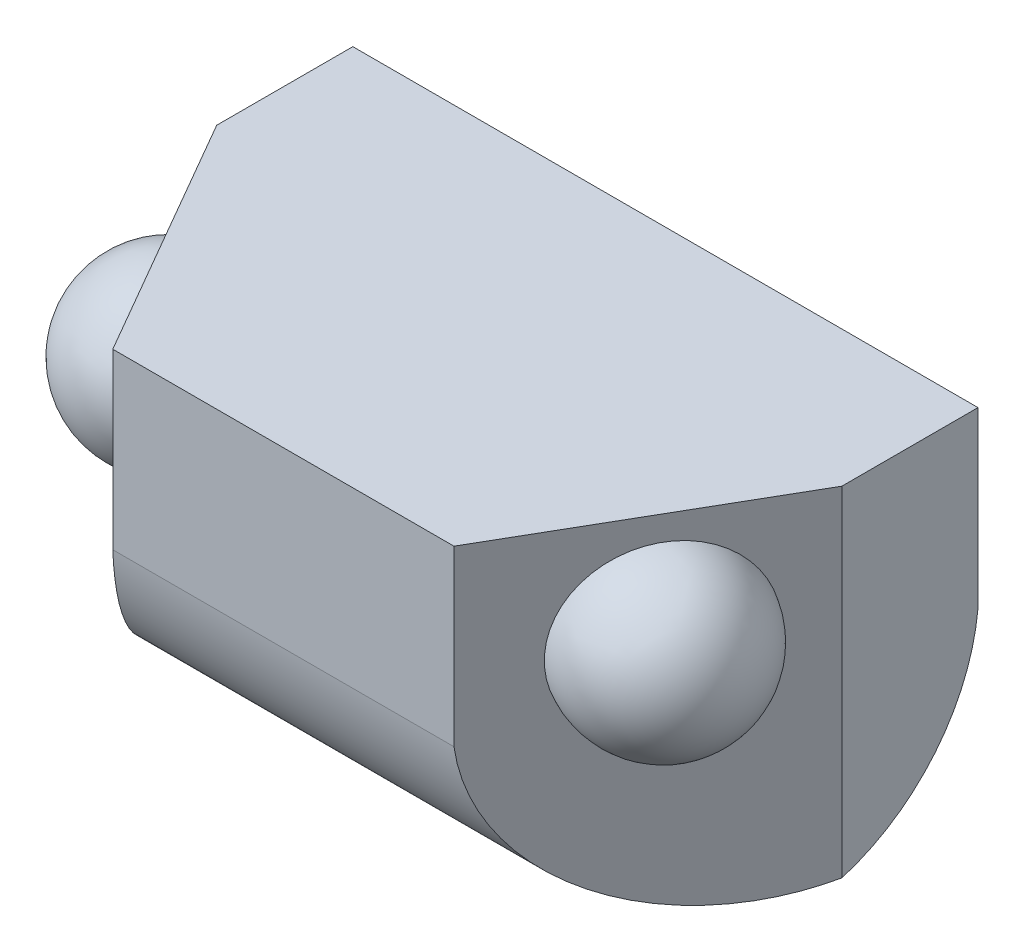
ISO-10303-21;
HEADER;
FILE_DESCRIPTION(('STEP AP214'),'2;1');
FILE_NAME('part.step','',(''),(''),'','','');
FILE_SCHEMA(('AUTOMOTIVE_DESIGN { 1 0 10303 214 1 1 1 1 }'));
ENDSEC;
DATA;
#1=APPLICATION_CONTEXT('core data for automotive mechanical design processes');
#2=APPLICATION_PROTOCOL_DEFINITION('international standard','automotive_design',2000,#1);
#3=PRODUCT_CONTEXT('',#1,'mechanical');
#4=PRODUCT('Part','Part','',(#3));
#5=PRODUCT_RELATED_PRODUCT_CATEGORY('part','',(#4));
#6=PRODUCT_DEFINITION_FORMATION('','',#4);
#7=PRODUCT_DEFINITION_CONTEXT('part definition',#1,'design');
#8=PRODUCT_DEFINITION('design','',#6,#7);
#9=PRODUCT_DEFINITION_SHAPE('','',#8);
#10=(LENGTH_UNIT() NAMED_UNIT(*) SI_UNIT(.MILLI.,.METRE.));
#11=(NAMED_UNIT(*) PLANE_ANGLE_UNIT() SI_UNIT($,.RADIAN.));
#12=(NAMED_UNIT(*) SI_UNIT($,.STERADIAN.) SOLID_ANGLE_UNIT());
#13=UNCERTAINTY_MEASURE_WITH_UNIT(LENGTH_MEASURE(1.E-05),#10,'distance_accuracy_value','');
#14=(GEOMETRIC_REPRESENTATION_CONTEXT(3) GLOBAL_UNCERTAINTY_ASSIGNED_CONTEXT((#13)) GLOBAL_UNIT_ASSIGNED_CONTEXT((#10,
#11,#12)) REPRESENTATION_CONTEXT('',''));
#15=CARTESIAN_POINT('',(0.,0.,0.));
#16=DIRECTION('',(0.,0.,1.));
#17=DIRECTION('',(1.,0.,0.));
#18=AXIS2_PLACEMENT_3D('',#15,#16,#17);
#19=CARTESIAN_POINT('',(90.,50.,55.));
#20=DIRECTION('',(-1.,0.,0.));
#21=DIRECTION('',(0.,0.,1.));
#22=AXIS2_PLACEMENT_3D('',#19,#20,#21);
#23=PLANE('',#22);
#24=DIRECTION('',(0.,1.,0.));
#25=VECTOR('',#24,1.);
#26=CARTESIAN_POINT('',(90.,-50.,-15.808309090852));
#27=LINE('',#26,#25);
#28=CARTESIAN_POINT('',(90.,-47.6901536046892,-15.808309090852));
#29=VERTEX_POINT('',#28);
#30=CARTESIAN_POINT('',(90.,50.,-15.808309090852));
#31=VERTEX_POINT('',#30);
#32=EDGE_CURVE('E175',#29,#31,#27,.T.);
#33=ORIENTED_EDGE('',*,*,#32,.F.);
#34=CARTESIAN_POINT('',(90.,5.25,0.));
#35=DIRECTION('',(-1.,0.,0.));
#36=DIRECTION('',(0.,0.,1.));
#37=AXIS2_PLACEMENT_3D('',#34,#35,#36);
#38=CIRCLE('',#37,55.25);
#39=CARTESIAN_POINT('',(90.,0.,-55.));
#40=VERTEX_POINT('',#39);
#41=EDGE_CURVE('E117',#40,#29,#38,.T.);
#42=ORIENTED_EDGE('',*,*,#41,.F.);
#43=DIRECTION('',(0.,-1.,0.));
#44=VECTOR('',#43,1.);
#45=CARTESIAN_POINT('',(90.,50.,-55.));
#46=LINE('',#45,#44);
#47=CARTESIAN_POINT('',(90.,50.,-55.));
#48=VERTEX_POINT('',#47);
#49=EDGE_CURVE('E111',#48,#40,#46,.T.);
#50=ORIENTED_EDGE('',*,*,#49,.F.);
#51=DIRECTION('',(0.,0.,-1.));
#52=VECTOR('',#51,1.);
#53=CARTESIAN_POINT('',(90.,50.,55.));
#54=LINE('',#53,#52);
#55=EDGE_CURVE('E115',#31,#48,#54,.T.);
#56=ORIENTED_EDGE('',*,*,#55,.F.);
#57=EDGE_LOOP('',(#33,#42,#50,#56));
#58=FACE_BOUND('',#57,.T.);
#59=ADVANCED_FACE('F35',(#58),#23,.F.);
#60=CARTESIAN_POINT('',(-90.,50.,55.));
#61=DIRECTION('',(0.,0.,-1.));
#62=DIRECTION('',(-1.,0.,0.));
#63=AXIS2_PLACEMENT_3D('',#60,#61,#62);
#64=PLANE('',#63);
#65=DIRECTION('',(0.,1.,0.));
#66=VECTOR('',#65,1.);
#67=CARTESIAN_POINT('',(49.1188036855349,-50.,55.));
#68=LINE('',#67,#66);
#69=CARTESIAN_POINT('',(49.1188036855349,0.,55.));
#70=VERTEX_POINT('',#69);
#71=CARTESIAN_POINT('',(49.1188036855349,50.,55.));
#72=VERTEX_POINT('',#71);
#73=EDGE_CURVE('E56',#70,#72,#68,.T.);
#74=ORIENTED_EDGE('',*,*,#73,.T.);
#75=DIRECTION('',(1.,0.,0.));
#76=VECTOR('',#75,1.);
#77=CARTESIAN_POINT('',(-90.,50.,55.));
#78=LINE('',#77,#76);
#79=CARTESIAN_POINT('',(-49.1188036855349,50.,55.));
#80=VERTEX_POINT('',#79);
#81=EDGE_CURVE('E119',#80,#72,#78,.T.);
#82=ORIENTED_EDGE('',*,*,#81,.F.);
#83=DIRECTION('',(0.,1.,0.));
#84=VECTOR('',#83,1.);
#85=CARTESIAN_POINT('',(-49.1188036855349,-50.,55.));
#86=LINE('',#85,#84);
#87=CARTESIAN_POINT('',(-49.1188036855349,-1.31838984174237E-13,55.));
#88=VERTEX_POINT('',#87);
#89=EDGE_CURVE('E185',#88,#80,#86,.T.);
#90=ORIENTED_EDGE('',*,*,#89,.F.);
#91=DIRECTION('',(1.,0.,0.));
#92=VECTOR('',#91,1.);
#93=CARTESIAN_POINT('',(-90.,0.,55.));
#94=LINE('',#93,#92);
#95=EDGE_CURVE('E112',#88,#70,#94,.T.);
#96=ORIENTED_EDGE('',*,*,#95,.T.);
#97=EDGE_LOOP('',(#74,#82,#90,#96));
#98=FACE_BOUND('',#97,.T.);
#99=ADVANCED_FACE('F165',(#98),#64,.F.);
#100=CARTESIAN_POINT('',(0.,50.,0.));
#101=DIRECTION('',(0.,-1.,0.));
#102=DIRECTION('',(0.,0.,-1.));
#103=AXIS2_PLACEMENT_3D('',#100,#101,#102);
#104=PLANE('',#103);
#105=DIRECTION('',(0.499999999999995,0.,-0.866025403784442));
#106=VECTOR('',#105,1.);
#107=CARTESIAN_POINT('',(49.1188036855349,50.,55.));
#108=LINE('',#107,#106);
#109=EDGE_CURVE('E104',#72,#31,#108,.T.);
#110=ORIENTED_EDGE('',*,*,#109,.T.);
#111=ORIENTED_EDGE('',*,*,#55,.T.);
#112=DIRECTION('',(-1.,0.,0.));
#113=VECTOR('',#112,1.);
#114=CARTESIAN_POINT('',(-90.,50.,-55.));
#115=LINE('',#114,#113);
#116=CARTESIAN_POINT('',(-90.,50.,-55.));
#117=VERTEX_POINT('',#116);
#118=EDGE_CURVE('E189',#48,#117,#115,.T.);
#119=ORIENTED_EDGE('',*,*,#118,.T.);
#120=DIRECTION('',(0.,0.,1.));
#121=VECTOR('',#120,1.);
#122=CARTESIAN_POINT('',(-90.,50.,55.));
#123=LINE('',#122,#121);
#124=CARTESIAN_POINT('',(-90.,50.,-15.808309090852));
#125=VERTEX_POINT('',#124);
#126=EDGE_CURVE('E190',#117,#125,#123,.T.);
#127=ORIENTED_EDGE('',*,*,#126,.T.);
#128=DIRECTION('',(-0.499999999999995,0.,-0.866025403784442));
#129=VECTOR('',#128,1.);
#130=CARTESIAN_POINT('',(-49.1188036855349,50.,55.));
#131=LINE('',#130,#129);
#132=EDGE_CURVE('E197',#80,#125,#131,.T.);
#133=ORIENTED_EDGE('',*,*,#132,.F.);
#134=ORIENTED_EDGE('',*,*,#81,.T.);
#135=EDGE_LOOP('',(#110,#111,#119,#127,#133,#134));
#136=FACE_BOUND('',#135,.T.);
#137=ADVANCED_FACE('F170',(#136),#104,.F.);
#138=CARTESIAN_POINT('',(90.,5.25,0.));
#139=DIRECTION('',(-1.,0.,0.));
#140=DIRECTION('',(0.,0.,1.));
#141=AXIS2_PLACEMENT_3D('',#138,#139,#140);
#142=CYLINDRICAL_SURFACE('',#141,55.25);
#143=CARTESIAN_POINT('',(-5.,0.,-55.));
#144=CARTESIAN_POINT('',(-4.9999882713397,0.279659518933165,-55.0266919024899));
#145=CARTESIAN_POINT('',(-4.97646125694057,0.559703141862609,-55.0512512303978));
#146=CARTESIAN_POINT('',(-4.88273898229655,1.11247234758045,-55.0955576876296));
#147=CARTESIAN_POINT('',(-4.81249616533935,1.38519017806621,-55.1152998850892));
#148=CARTESIAN_POINT('',(-4.62716959780222,1.91522044803943,-55.1499072876402));
#149=CARTESIAN_POINT('',(-4.51209694455087,2.17253668191824,-55.1647736980242));
#150=CARTESIAN_POINT('',(-4.24032032857952,2.66432096288032,-55.1900124176434));
#151=CARTESIAN_POINT('',(-4.08362504195175,2.89879375769299,-55.2003856622792));
#152=CARTESIAN_POINT('',(-3.73344551712168,3.33766423818145,-55.2173312558781));
#153=CARTESIAN_POINT('',(-3.54005046751516,3.54213274780862,-55.2239126664963));
#154=CARTESIAN_POINT('',(-3.12169670119766,3.91582438939544,-55.2342059818018));
#155=CARTESIAN_POINT('',(-2.8967368831528,4.0850462910452,-55.2379177863357));
#156=CARTESIAN_POINT('',(-2.42147037747128,4.3835233384727,-55.2434077432643));
#157=CARTESIAN_POINT('',(-2.17114651764086,4.51275116384496,-55.2451845759358));
#158=CARTESIAN_POINT('',(-1.65237362938163,4.72741624185298,-55.2476333894184));
#159=CARTESIAN_POINT('',(-1.38392452879401,4.81285332014079,-55.2483053658306));
#160=CARTESIAN_POINT('',(-0.836173176497464,4.93759109485978,-55.249152372038));
#161=CARTESIAN_POINT('',(-0.556858316863721,4.97683643754874,-55.2493268059599));
#162=CARTESIAN_POINT('',(0.00439596159632484,5.00789116744948,-55.2494718050764));
#163=CARTESIAN_POINT('',(0.286335383235546,4.99970050381507,-55.2494423700525));
#164=CARTESIAN_POINT('',(0.844917722951899,4.93610678173556,-55.2491172882946));
#165=CARTESIAN_POINT('',(1.12155915457999,4.88069066613185,-55.2488215679352));
#166=CARTESIAN_POINT('',(1.66161197844716,4.72420175618525,-55.2475529541873));
#167=CARTESIAN_POINT('',(1.92502332897145,4.62312881789523,-55.2465800586637));
#168=CARTESIAN_POINT('',(2.43111359951102,4.37820836392666,-55.2432566222232));
#169=CARTESIAN_POINT('',(2.67379410958054,4.2343641326026,-55.2409061870724));
#170=CARTESIAN_POINT('',(3.13154413165766,3.90799718981734,-55.2339395469131));
#171=CARTESIAN_POINT('',(3.3466138323362,3.72547474267577,-55.2293233573881));
#172=CARTESIAN_POINT('',(3.74286107052696,3.32713794025803,-55.2168876272833));
#173=CARTESIAN_POINT('',(3.924066165402,3.11135091734098,-55.2090707079778));
#174=CARTESIAN_POINT('',(4.24766193075809,2.65257655639623,-55.189387691919));
#175=CARTESIAN_POINT('',(4.39005323395633,2.40958966185425,-55.1775216611788));
#176=CARTESIAN_POINT('',(4.6318694801889,1.90375134883832,-55.1491534942709));
#177=CARTESIAN_POINT('',(4.73135093483771,1.64092659615991,-55.1326575032731));
#178=CARTESIAN_POINT('',(4.88491901931252,1.10267544659057,-55.0947814161674));
#179=CARTESIAN_POINT('',(4.93900561011759,0.827249038867615,-55.0734013158614));
#180=CARTESIAN_POINT('',(5.00048040551371,0.271212582640456,-55.0259223707046));
#181=CARTESIAN_POINT('',(5.00779732396879,-0.00940472530817487,-54.9998163849211));
#182=CARTESIAN_POINT('',(4.97554657880262,-0.567522063771189,-54.9435858405492));
#183=CARTESIAN_POINT('',(4.93597699645144,-0.845021966243265,-54.9134611175473));
#184=CARTESIAN_POINT('',(4.81080524424787,-1.39109959315269,-54.8501084837208));
#185=CARTESIAN_POINT('',(4.72488879594081,-1.65960295248719,-54.8168606815751));
#186=CARTESIAN_POINT('',(4.50932932480625,-2.17826308213933,-54.7489898266635));
#187=CARTESIAN_POINT('',(4.37968378511944,-2.42841879543584,-54.7143666948408));
#188=CARTESIAN_POINT('',(4.07912698575748,-2.90529705042896,-54.6453308489157));
#189=CARTESIAN_POINT('',(3.90791299709344,-3.1318294065235,-54.6109216703153));
#190=CARTESIAN_POINT('',(3.52944070141964,-3.55291217136776,-54.5446309000419));
#191=CARTESIAN_POINT('',(3.3221821238903,-3.74746234006548,-54.5127493273416));
#192=CARTESIAN_POINT('',(2.87764403254414,-4.09869314019168,-54.4536151108917));
#193=CARTESIAN_POINT('',(2.64040926491956,-4.25542922344469,-54.4263557067034));
#194=CARTESIAN_POINT('',(2.1423200751838,-4.52668328223075,-54.3782863698611));
#195=CARTESIAN_POINT('',(1.88146762254956,-4.64120477400381,-54.3574759000699));
#196=CARTESIAN_POINT('',(1.34718287923227,-4.82324606851124,-54.32403449836));
#197=CARTESIAN_POINT('',(1.07396048724357,-4.89136270601827,-54.3112998529331));
#198=CARTESIAN_POINT('',(0.519709943191823,-4.98083130353758,-54.2945181838));
#199=CARTESIAN_POINT('',(0.238682507704629,-5.00218754231259,-54.2904703652151));
#200=CARTESIAN_POINT('',(-0.31913402965054,-4.99748953950668,-54.2913570276702));
#201=CARTESIAN_POINT('',(-0.595928942434066,-4.97207408219445,-54.2961704861685));
#202=CARTESIAN_POINT('',(-1.14122987180414,-4.87588404394255,-54.314190899121));
#203=CARTESIAN_POINT('',(-1.40973595743377,-4.80510984093256,-54.3273977836411));
#204=CARTESIAN_POINT('',(-1.93088576538702,-4.62040056990761,-54.361258638705));
#205=CARTESIAN_POINT('',(-2.1835327098653,-4.50647430254438,-54.3819110907205));
#206=CARTESIAN_POINT('',(-2.66615679666948,-4.23883939629217,-54.429245969308));
#207=CARTESIAN_POINT('',(-2.89613315939026,-4.08512938996244,-54.4559286031446));
#208=CARTESIAN_POINT('',(-3.33016404145042,-3.74003745934505,-54.5139675284857));
#209=CARTESIAN_POINT('',(-3.53383943755744,-3.54818832597301,-54.545380475956));
#210=CARTESIAN_POINT('',(-3.9063041500025,-3.13344795591852,-54.6106609263638));
#211=CARTESIAN_POINT('',(-4.07508278839618,-2.91054725268537,-54.6445291763223));
#212=CARTESIAN_POINT('',(-4.3752626347509,-2.43657139720076,-54.7132270193043));
#213=CARTESIAN_POINT('',(-4.50611155560612,-2.18514761826587,-54.7480634313731));
#214=CARTESIAN_POINT('',(-4.72346941124214,-1.66385685549536,-54.8163289194608));
#215=CARTESIAN_POINT('',(-4.8100261957486,-1.39401013321266,-54.8497594782513));
#216=CARTESIAN_POINT('',(-4.91528170779142,-0.935630489751629,-54.9029567659093));
#217=CARTESIAN_POINT('',(-4.94699281039521,-0.750078529835498,-54.9235546138037));
#218=CARTESIAN_POINT('',(-4.98935589784394,-0.376409085851396,-54.963090551674));
#219=CARTESIAN_POINT('',(-5.00000789677485,-0.18829160349953,-54.9820286427602));
#220=CARTESIAN_POINT('',(-5.,0.,-55.));
#221=B_SPLINE_CURVE_WITH_KNOTS('',3,(#143,#144,#145,#146,#147,#148,#149,#150,#151,#152,#153,
#154,#155,#156,#157,#158,#159,#160,#161,#162,#163,#164,#165,#166,#167,#168,#169,#170,#171,#172,
#173,#174,#175,#176,#177,#178,#179,#180,#181,#182,#183,#184,#185,#186,#187,#188,#189,#190,#191,
#192,#193,#194,#195,#196,#197,#198,#199,#200,#201,#202,#203,#204,#205,#206,#207,#208,#209,#210,
#211,#212,#213,#214,#215,#216,#217,#218,#219,#220),.UNSPECIFIED.,.T.,.F.,(4,2,2,2,2,2,2,2,2,2,2,
2,2,2,2,2,2,2,2,2,2,2,2,2,2,2,2,2,2,2,2,2,2,2,2,2,2,2,4),(0.,0.842108421796893,1.68507542531736,
2.52783389040477,3.37041682310677,4.21097772404448,5.05156796048998,5.89273115260518,
6.73389769369151,7.5760712214559,8.41824565193794,9.26065300711714,10.1030630182622,
10.9454083584867,11.7877479424677,12.6293990581981,13.4710364530585,14.3115620146584,
15.1520882987639,15.993895404582,16.8357369607485,17.6833601573634,18.5310321478681,
19.3850730753091,20.239120412721,21.091907628991,21.9446237967831,22.7861545437178,
23.6276082840187,24.4576550558905,25.2876949118912,26.1175655764057,26.9474647689,
27.788237740786,28.6292675985432,29.4819903922115,30.3337900162869,30.9007725088697,
31.4677546222105),.UNSPECIFIED.);
#222=CARTESIAN_POINT('',(5.,0.,-55.));
#223=VERTEX_POINT('',#222);
#224=CARTESIAN_POINT('',(-5.,0.,-55.));
#225=VERTEX_POINT('',#224);
#226=EDGE_CURVE('E48',#223,#225,#221,.T.);
#227=ORIENTED_EDGE('',*,*,#226,.F.);
#228=DIRECTION('',(-1.,0.,0.));
#229=VECTOR('',#228,1.);
#230=CARTESIAN_POINT('',(-90.,0.,-55.));
#231=LINE('',#230,#229);
#232=EDGE_CURVE('E100',#40,#223,#231,.T.);
#233=ORIENTED_EDGE('',*,*,#232,.F.);
#234=ORIENTED_EDGE('',*,*,#41,.T.);
#235=CARTESIAN_POINT('',(80.8730684909639,5.25,0.));
#236=DIRECTION('',(0.866025403784442,0.,0.499999999999995));
#237=DIRECTION('',(-0.499999999999995,0.,0.866025403784442));
#238=AXIS2_PLACEMENT_3D('',#235,#236,#237);
#239=ELLIPSE('',#238,63.7972047454534,55.25);
#240=EDGE_CURVE('E95',#29,#70,#239,.F.);
#241=ORIENTED_EDGE('',*,*,#240,.T.);
#242=ORIENTED_EDGE('',*,*,#95,.F.);
#243=CARTESIAN_POINT('',(-80.8730684909639,5.25,0.));
#244=DIRECTION('',(0.866025403784442,0.,-0.499999999999995));
#245=DIRECTION('',(-0.499999999999995,0.,-0.866025403784442));
#246=AXIS2_PLACEMENT_3D('',#243,#244,#245);
#247=ELLIPSE('',#246,63.7972047454534,55.25);
#248=CARTESIAN_POINT('',(-90.,-47.6901536046892,-15.808309090852));
#249=VERTEX_POINT('',#248);
#250=EDGE_CURVE('E126',#249,#88,#247,.F.);
#251=ORIENTED_EDGE('',*,*,#250,.F.);
#252=CARTESIAN_POINT('',(-90.,5.25,0.));
#253=DIRECTION('',(-1.,0.,0.));
#254=DIRECTION('',(0.,0.,1.));
#255=AXIS2_PLACEMENT_3D('',#252,#253,#254);
#256=CIRCLE('',#255,55.25);
#257=CARTESIAN_POINT('',(-90.,0.,-55.));
#258=VERTEX_POINT('',#257);
#259=EDGE_CURVE('E179',#258,#249,#256,.T.);
#260=ORIENTED_EDGE('',*,*,#259,.F.);
#261=EDGE_CURVE('E103',#225,#258,#231,.T.);
#262=ORIENTED_EDGE('',*,*,#261,.F.);
#263=EDGE_LOOP('',(#227,#233,#234,#241,#242,#251,#260,#262));
#264=FACE_BOUND('',#263,.T.);
#265=ADVANCED_FACE('F98',(#264),#142,.T.);
#266=CARTESIAN_POINT('',(-90.,50.,-55.));
#267=DIRECTION('',(0.,0.,1.));
#268=DIRECTION('',(1.,0.,0.));
#269=AXIS2_PLACEMENT_3D('',#266,#267,#268);
#270=PLANE('',#269);
#271=ORIENTED_EDGE('',*,*,#232,.T.);
#272=CARTESIAN_POINT('',(0.,0.,-55.));
#273=DIRECTION('',(0.,0.,1.));
#274=DIRECTION('',(1.,0.,0.));
#275=AXIS2_PLACEMENT_3D('',#272,#273,#274);
#276=CIRCLE('',#275,5.);
#277=EDGE_CURVE('E42',#223,#225,#276,.T.);
#278=ORIENTED_EDGE('',*,*,#277,.T.);
#279=ORIENTED_EDGE('',*,*,#261,.T.);
#280=DIRECTION('',(0.,-1.,0.));
#281=VECTOR('',#280,1.);
#282=CARTESIAN_POINT('',(-90.,50.,-55.));
#283=LINE('',#282,#281);
#284=EDGE_CURVE('E122',#117,#258,#283,.T.);
#285=ORIENTED_EDGE('',*,*,#284,.F.);
#286=ORIENTED_EDGE('',*,*,#118,.F.);
#287=ORIENTED_EDGE('',*,*,#49,.T.);
#288=EDGE_LOOP('',(#271,#278,#279,#285,#286,#287));
#289=FACE_BOUND('',#288,.T.);
#290=ADVANCED_FACE('F108',(#289),#270,.F.);
#291=CARTESIAN_POINT('',(-90.,50.,55.));
#292=DIRECTION('',(1.,0.,0.));
#293=DIRECTION('',(0.,0.,-1.));
#294=AXIS2_PLACEMENT_3D('',#291,#292,#293);
#295=PLANE('',#294);
#296=ORIENTED_EDGE('',*,*,#259,.T.);
#297=DIRECTION('',(0.,1.,0.));
#298=VECTOR('',#297,1.);
#299=CARTESIAN_POINT('',(-90.,-50.,-15.808309090852));
#300=LINE('',#299,#298);
#301=EDGE_CURVE('E182',#249,#125,#300,.T.);
#302=ORIENTED_EDGE('',*,*,#301,.T.);
#303=ORIENTED_EDGE('',*,*,#126,.F.);
#304=ORIENTED_EDGE('',*,*,#284,.T.);
#305=EDGE_LOOP('',(#296,#302,#303,#304));
#306=FACE_BOUND('',#305,.T.);
#307=ADVANCED_FACE('F157',(#306),#295,.F.);
#308=CARTESIAN_POINT('',(-49.1188036855349,-50.,55.));
#309=DIRECTION('',(0.866025403784442,0.,-0.499999999999995));
#310=DIRECTION('',(-0.499999999999995,0.,-0.866025403784442));
#311=AXIS2_PLACEMENT_3D('',#308,#309,#310);
#312=PLANE('',#311);
#313=CARTESIAN_POINT('',(-71.1373818974067,17.9425764885766,16.8627038266085));
#314=DIRECTION('',(0.866025403784442,0.,-0.499999999999995));
#315=DIRECTION('',(-0.499999999999995,0.,-0.866025403784442));
#316=AXIS2_PLACEMENT_3D('',#313,#314,#315);
#317=CIRCLE('',#316,25.);
#318=CARTESIAN_POINT('',(-83.6373818974066,17.9425764885766,-4.78793126800255));
#319=VERTEX_POINT('',#318);
#320=EDGE_CURVE('E128',#319,#319,#317,.T.);
#321=ORIENTED_EDGE('',*,*,#320,.T.);
#322=EDGE_LOOP('',(#321));
#323=FACE_BOUND('',#322,.T.);
#324=ORIENTED_EDGE('',*,*,#301,.F.);
#325=ORIENTED_EDGE('',*,*,#250,.T.);
#326=ORIENTED_EDGE('',*,*,#89,.T.);
#327=ORIENTED_EDGE('',*,*,#132,.T.);
#328=EDGE_LOOP('',(#324,#325,#326,#327));
#329=FACE_BOUND('',#328,.T.);
#330=ADVANCED_FACE('F154',(#323,#329),#312,.F.);
#331=CARTESIAN_POINT('',(49.1188036855349,-50.,55.));
#332=DIRECTION('',(0.866025403784442,0.,0.499999999999995));
#333=DIRECTION('',(0.499999999999995,0.,-0.866025403784442));
#334=AXIS2_PLACEMENT_3D('',#331,#332,#333);
#335=PLANE('',#334);
#336=CARTESIAN_POINT('',(71.1373818974067,17.9425764885766,16.8627038266085));
#337=DIRECTION('',(0.866025403784442,0.,0.499999999999995));
#338=DIRECTION('',(0.499999999999995,0.,-0.866025403784442));
#339=AXIS2_PLACEMENT_3D('',#336,#337,#338);
#340=CIRCLE('',#339,25.);
#341=CARTESIAN_POINT('',(83.6373818974066,17.9425764885766,-4.78793126800255));
#342=VERTEX_POINT('',#341);
#343=EDGE_CURVE('E11',#342,#342,#340,.T.);
#344=ORIENTED_EDGE('',*,*,#343,.F.);
#345=EDGE_LOOP('',(#344));
#346=FACE_BOUND('',#345,.T.);
#347=ORIENTED_EDGE('',*,*,#32,.T.);
#348=ORIENTED_EDGE('',*,*,#109,.F.);
#349=ORIENTED_EDGE('',*,*,#73,.F.);
#350=ORIENTED_EDGE('',*,*,#240,.F.);
#351=EDGE_LOOP('',(#347,#348,#349,#350));
#352=FACE_BOUND('',#351,.T.);
#353=ADVANCED_FACE('F151',(#346,#352),#335,.T.);
#354=CARTESIAN_POINT('',(0.,0.,-45.));
#355=DIRECTION('',(0.,0.,-1.));
#356=DIRECTION('',(-1.,0.,0.));
#357=AXIS2_PLACEMENT_3D('',#354,#355,#356);
#358=CYLINDRICAL_SURFACE('',#357,5.);
#359=ORIENTED_EDGE('',*,*,#277,.F.);
#360=ORIENTED_EDGE('',*,*,#226,.T.);
#361=EDGE_LOOP('',(#359,#360));
#362=FACE_BOUND('',#361,.T.);
#363=CARTESIAN_POINT('',(0.,0.,-65.));
#364=DIRECTION('',(0.,0.,-1.));
#365=DIRECTION('',(-1.,0.,0.));
#366=AXIS2_PLACEMENT_3D('',#363,#364,#365);
#367=CIRCLE('',#366,5.);
#368=CARTESIAN_POINT('',(-5.,0.,-65.));
#369=VERTEX_POINT('',#368);
#370=EDGE_CURVE('E105',#369,#369,#367,.T.);
#371=ORIENTED_EDGE('',*,*,#370,.F.);
#372=EDGE_LOOP('',(#371));
#373=FACE_BOUND('',#372,.T.);
#374=ADVANCED_FACE('F90',(#362,#373),#358,.T.);
#375=CARTESIAN_POINT('',(0.,0.,-65.));
#376=DIRECTION('',(0.,0.,-1.));
#377=DIRECTION('',(-1.,0.,0.));
#378=AXIS2_PLACEMENT_3D('',#375,#376,#377);
#379=PLANE('',#378);
#380=ORIENTED_EDGE('',*,*,#370,.T.);
#381=EDGE_LOOP('',(#380));
#382=FACE_BOUND('',#381,.T.);
#383=ADVANCED_FACE('F150',(#382),#379,.T.);
#384=CARTESIAN_POINT('',(-71.1373818974067,17.9425764885766,16.8627038266085));
#385=DIRECTION('',(0.,1.,0.));
#386=DIRECTION('',(-0.499999999999995,0.,-0.866025403784442));
#387=AXIS2_PLACEMENT_3D('',#384,#385,#386);
#388=SPHERICAL_SURFACE('',#387,25.);
#389=CARTESIAN_POINT('',(-71.1373818974067,17.9425764885766,16.8627038266085));
#390=DIRECTION('',(0.866025403784442,0.,-0.499999999999995));
#391=DIRECTION('',(-0.499999999999995,0.,-0.866025403784442));
#392=AXIS2_PLACEMENT_3D('',#389,#390,#391);
#393=SPHERICAL_SURFACE('',#392,25.);
#394=ORIENTED_EDGE('',*,*,#320,.F.);
#395=EDGE_LOOP('',(#394));
#396=FACE_BOUND('',#395,.T.);
#397=ADVANCED_FACE('F251',(#396),#393,.T.);
#398=CARTESIAN_POINT('',(71.1373818974067,17.9425764885766,16.8627038266085));
#399=DIRECTION('',(0.,1.,0.));
#400=DIRECTION('',(0.499999999999995,0.,-0.866025403784442));
#401=AXIS2_PLACEMENT_3D('',#398,#399,#400);
#402=SPHERICAL_SURFACE('',#401,25.);
#403=CARTESIAN_POINT('',(71.1373818974067,17.9425764885766,16.8627038266085));
#404=DIRECTION('',(0.866025403784442,0.,0.499999999999995));
#405=DIRECTION('',(0.499999999999995,0.,-0.866025403784442));
#406=AXIS2_PLACEMENT_3D('',#403,#404,#405);
#407=SPHERICAL_SURFACE('',#406,25.);
#408=ORIENTED_EDGE('',*,*,#343,.T.);
#409=EDGE_LOOP('',(#408));
#410=FACE_BOUND('',#409,.T.);
#411=ADVANCED_FACE('F256',(#410),#407,.T.);
#412=CLOSED_SHELL('',(#59,#99,#137,#265,#290,#307,#330,#353,#374,#383,#397,#411));
#413=MANIFOLD_SOLID_BREP('B2',#412);
#414=ADVANCED_BREP_SHAPE_REPRESENTATION('',(#18,#413),#14);
#415=SHAPE_DEFINITION_REPRESENTATION(#9,#414);
ENDSEC;
END-ISO-10303-21;
